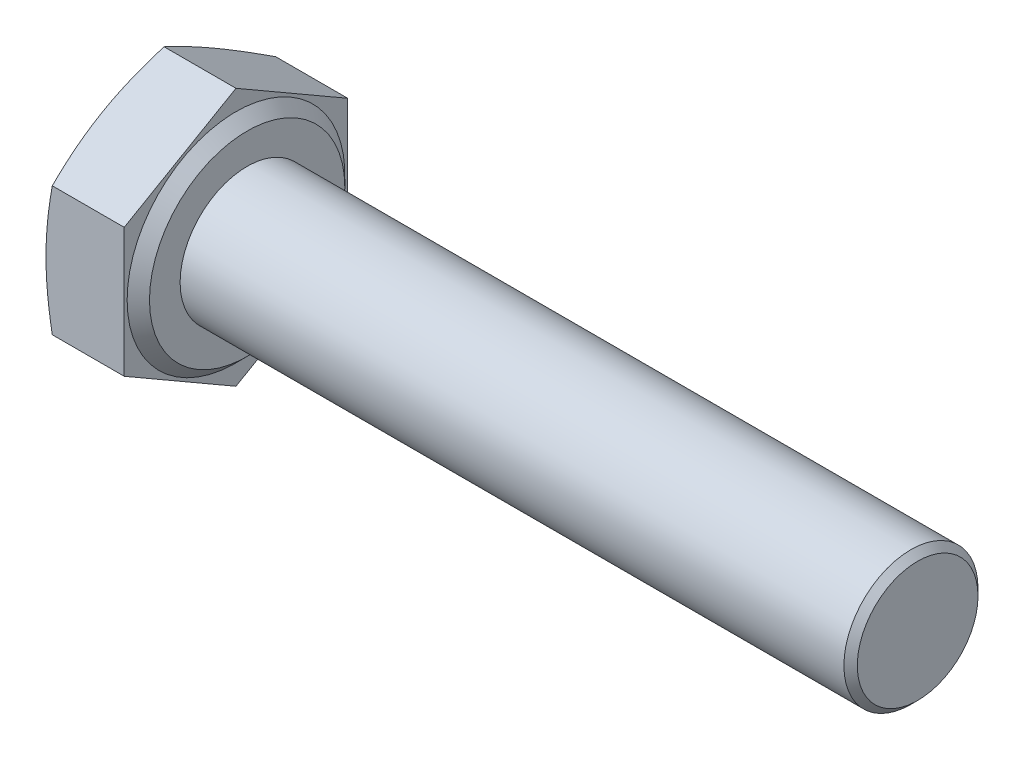
ISO-10303-21;
HEADER;
FILE_DESCRIPTION(('STEP AP214'),'2;1');
FILE_NAME('part.step','',(''),(''),'','','');
FILE_SCHEMA(('AUTOMOTIVE_DESIGN { 1 0 10303 214 1 1 1 1 }'));
ENDSEC;
DATA;
#1=APPLICATION_CONTEXT('core data for automotive mechanical design processes');
#2=APPLICATION_PROTOCOL_DEFINITION('international standard','automotive_design',2000,#1);
#3=PRODUCT_CONTEXT('',#1,'mechanical');
#4=PRODUCT('Part','Part','',(#3));
#5=PRODUCT_RELATED_PRODUCT_CATEGORY('part','',(#4));
#6=PRODUCT_DEFINITION_FORMATION('','',#4);
#7=PRODUCT_DEFINITION_CONTEXT('part definition',#1,'design');
#8=PRODUCT_DEFINITION('design','',#6,#7);
#9=PRODUCT_DEFINITION_SHAPE('','',#8);
#10=(LENGTH_UNIT() NAMED_UNIT(*) SI_UNIT(.MILLI.,.METRE.));
#11=(NAMED_UNIT(*) PLANE_ANGLE_UNIT() SI_UNIT($,.RADIAN.));
#12=(NAMED_UNIT(*) SI_UNIT($,.STERADIAN.) SOLID_ANGLE_UNIT());
#13=UNCERTAINTY_MEASURE_WITH_UNIT(LENGTH_MEASURE(1.E-05),#10,'distance_accuracy_value','');
#14=(GEOMETRIC_REPRESENTATION_CONTEXT(3) GLOBAL_UNCERTAINTY_ASSIGNED_CONTEXT((#13)) GLOBAL_UNIT_ASSIGNED_CONTEXT((#10,
#11,#12)) REPRESENTATION_CONTEXT('',''));
#15=CARTESIAN_POINT('',(0.,0.,0.));
#16=DIRECTION('',(0.,0.,1.));
#17=DIRECTION('',(1.,0.,0.));
#18=AXIS2_PLACEMENT_3D('',#15,#16,#17);
#19=CARTESIAN_POINT('',(1.,-0.721687836487032,1.25));
#20=DIRECTION('',(-1.,0.,0.));
#21=DIRECTION('',(0.,0.,1.));
#22=AXIS2_PLACEMENT_3D('',#19,#20,#21);
#23=PLANE('',#22);
#24=CARTESIAN_POINT('',(1.,0.,0.));
#25=DIRECTION('',(-1.,0.,0.));
#26=DIRECTION('',(0.,0.,1.));
#27=AXIS2_PLACEMENT_3D('',#24,#25,#26);
#28=CIRCLE('',#27,1.0925);
#29=CARTESIAN_POINT('',(1.,0.,1.0925));
#30=VERTEX_POINT('',#29);
#31=EDGE_CURVE('E268',#30,#30,#28,.T.);
#32=ORIENTED_EDGE('',*,*,#31,.F.);
#33=EDGE_LOOP('',(#32));
#34=FACE_BOUND('',#33,.T.);
#35=CARTESIAN_POINT('',(1.,0.,0.));
#36=DIRECTION('',(-1.,0.,0.));
#37=DIRECTION('',(0.,0.,1.));
#38=AXIS2_PLACEMENT_3D('',#35,#36,#37);
#39=CIRCLE('',#38,0.75);
#40=CARTESIAN_POINT('',(1.,0.,0.75));
#41=VERTEX_POINT('',#40);
#42=EDGE_CURVE('E157',#41,#41,#39,.F.);
#43=ORIENTED_EDGE('',*,*,#42,.F.);
#44=EDGE_LOOP('',(#43));
#45=FACE_BOUND('',#44,.T.);
#46=ADVANCED_FACE('F39',(#34,#45),#23,.F.);
#47=CARTESIAN_POINT('',(1.,-0.721687836487032,1.25));
#48=DIRECTION('',(0.,0.866025403784439,-0.5));
#49=DIRECTION('',(0.,0.5,0.866025403784439));
#50=AXIS2_PLACEMENT_3D('',#47,#48,#49);
#51=PLANE('',#50);
#52=CARTESIAN_POINT('',(0.0703934962245912,-1.44340454048752,-4.99999999998259E-05));
#53=CARTESIAN_POINT('',(0.0595105408724881,-1.41351548357099,0.05171936516975));
#54=CARTESIAN_POINT('',(0.0496105972959138,-1.38352786337432,0.10365944694846));
#55=CARTESIAN_POINT('',(0.0321931633280293,-1.32335763411529,0.207877341128181));
#56=CARTESIAN_POINT('',(0.0246775373589187,-1.29317489120078,0.260155385367894));
#57=CARTESIAN_POINT('',(0.0125212222860797,-1.23294938687038,0.364469018779612));
#58=CARTESIAN_POINT('',(0.00785401755391675,-1.20290800096114,0.41650222550419));
#59=CARTESIAN_POINT('',(0.00159398285412419,-1.14275497455162,0.520690323474514));
#60=CARTESIAN_POINT('',(0.,-1.11264336464108,0.572845161737257));
#61=CARTESIAN_POINT('',(0.,-1.05242014482001,0.677154838262743));
#62=CARTESIAN_POINT('',(0.00159398285412424,-1.02230853490948,0.729309676525486));
#63=CARTESIAN_POINT('',(0.00785401755391676,-0.962155508499954,0.833497774495811));
#64=CARTESIAN_POINT('',(0.0125212222860797,-0.93211412259072,0.885530981220388));
#65=CARTESIAN_POINT('',(0.0246775373589186,-0.871888618260317,0.989844614632106));
#66=CARTESIAN_POINT('',(0.0321931633280292,-0.841705875345811,1.04212265887182));
#67=CARTESIAN_POINT('',(0.0496105972959138,-0.781535646086773,1.14634055305154));
#68=CARTESIAN_POINT('',(0.0595105408724881,-0.751548025890104,1.19828063483025));
#69=CARTESIAN_POINT('',(0.0703934962245913,-0.721658968973573,1.25005));
#70=B_SPLINE_CURVE_WITH_KNOTS('',3,(#52,#53,#54,#55,#56,#57,#58,#59,#60,#61,#62,#63,#64,#65,#66,
#67,#68,#69),.UNSPECIFIED.,.F.,.F.,(4,2,2,2,2,2,2,2,4),(0.,0.182300878208644,0.364743957609247,
0.545461705562646,0.726111645974348,0.90676158638605,1.08747933433945,1.26992241374005,
1.4522232919487),.UNSPECIFIED.);
#71=CARTESIAN_POINT('',(0.0703829889937536,-1.44337567297406,0.));
#72=VERTEX_POINT('',#71);
#73=CARTESIAN_POINT('',(0.,-1.08253175473055,0.625));
#74=VERTEX_POINT('',#73);
#75=EDGE_CURVE('E288',#72,#74,#70,.T.);
#76=ORIENTED_EDGE('',*,*,#75,.F.);
#77=DIRECTION('',(-1.,0.,0.));
#78=VECTOR('',#77,1.);
#79=CARTESIAN_POINT('',(1.,-1.44337567297406,0.));
#80=LINE('',#79,#78);
#81=CARTESIAN_POINT('',(0.875,-1.44337567297406,0.));
#82=VERTEX_POINT('',#81);
#83=EDGE_CURVE('E150',#82,#72,#80,.T.);
#84=ORIENTED_EDGE('',*,*,#83,.F.);
#85=DIRECTION('',(0.,-0.5,-0.866025403784439));
#86=VECTOR('',#85,1.);
#87=CARTESIAN_POINT('',(0.875,-0.721687836487032,1.25));
#88=LINE('',#87,#86);
#89=CARTESIAN_POINT('',(0.875,-0.721687836487032,1.25));
#90=VERTEX_POINT('',#89);
#91=EDGE_CURVE('E141',#90,#82,#88,.T.);
#92=ORIENTED_EDGE('',*,*,#91,.F.);
#93=DIRECTION('',(-1.,0.,0.));
#94=VECTOR('',#93,1.);
#95=CARTESIAN_POINT('',(1.,-0.721687836487032,1.25));
#96=LINE('',#95,#94);
#97=CARTESIAN_POINT('',(0.0703829889937536,-0.721687836487032,1.25));
#98=VERTEX_POINT('',#97);
#99=EDGE_CURVE('E136',#90,#98,#96,.T.);
#100=ORIENTED_EDGE('',*,*,#99,.T.);
#101=EDGE_CURVE('E130',#74,#98,#70,.T.);
#102=ORIENTED_EDGE('',*,*,#101,.F.);
#103=EDGE_LOOP('',(#76,#84,#92,#100,#102));
#104=FACE_BOUND('',#103,.T.);
#105=ADVANCED_FACE('F173',(#104),#51,.F.);
#106=CARTESIAN_POINT('',(1.,-1.44337567297406,0.));
#107=DIRECTION('',(0.,0.866025403784439,0.5));
#108=DIRECTION('',(0.,-0.5,0.866025403784439));
#109=AXIS2_PLACEMENT_3D('',#106,#107,#108);
#110=PLANE('',#109);
#111=CARTESIAN_POINT('',(0.0703934962245913,-0.721658968973574,-1.25005));
#112=CARTESIAN_POINT('',(0.0595105408724882,-0.751548025890105,-1.19828063483025));
#113=CARTESIAN_POINT('',(0.0496105972959139,-0.781535646086774,-1.14634055305154));
#114=CARTESIAN_POINT('',(0.0321931633280294,-0.841705875345812,-1.04212265887182));
#115=CARTESIAN_POINT('',(0.0246775373589187,-0.871888618260317,-0.989844614632106));
#116=CARTESIAN_POINT('',(0.0125212222860798,-0.932114122590721,-0.885530981220388));
#117=CARTESIAN_POINT('',(0.00785401755391687,-0.962155508499955,-0.83349777449581));
#118=CARTESIAN_POINT('',(0.00159398285412432,-1.02230853490948,-0.729309676525486));
#119=CARTESIAN_POINT('',(0.,-1.05242014482001,-0.677154838262743));
#120=CARTESIAN_POINT('',(0.,-1.11264336464109,-0.572845161737257));
#121=CARTESIAN_POINT('',(0.00159398285412432,-1.14275497455162,-0.520690323474514));
#122=CARTESIAN_POINT('',(0.00785401755391688,-1.20290800096114,-0.416502225504189));
#123=CARTESIAN_POINT('',(0.0125212222860798,-1.23294938687038,-0.364469018779612));
#124=CARTESIAN_POINT('',(0.0246775373589187,-1.29317489120078,-0.260155385367894));
#125=CARTESIAN_POINT('',(0.0321931633280294,-1.32335763411529,-0.207877341128181));
#126=CARTESIAN_POINT('',(0.0496105972959138,-1.38352786337432,-0.10365944694846));
#127=CARTESIAN_POINT('',(0.0595105408724882,-1.41351548357099,-0.0517193651697496));
#128=CARTESIAN_POINT('',(0.0703934962245912,-1.44340454048752,5.00000000003068E-05));
#129=B_SPLINE_CURVE_WITH_KNOTS('',3,(#111,#112,#113,#114,#115,#116,#117,#118,#119,#120,#121,
#122,#123,#124,#125,#126,#127,#128),.UNSPECIFIED.,.F.,.F.,(4,2,2,2,2,2,2,2,4),(0.,
0.182300878208644,0.364743957609246,0.545461705562646,0.726111645974348,0.90676158638605,
1.08747933433945,1.26992241374005,1.4522232919487),.UNSPECIFIED.);
#130=CARTESIAN_POINT('',(0.0703829889937536,-0.721687836487033,-1.25));
#131=VERTEX_POINT('',#130);
#132=CARTESIAN_POINT('',(0.,-1.08253175473055,-0.625));
#133=VERTEX_POINT('',#132);
#134=EDGE_CURVE('E237',#131,#133,#129,.T.);
#135=ORIENTED_EDGE('',*,*,#134,.F.);
#136=DIRECTION('',(-1.,0.,0.));
#137=VECTOR('',#136,1.);
#138=CARTESIAN_POINT('',(1.,-0.721687836487033,-1.25));
#139=LINE('',#138,#137);
#140=CARTESIAN_POINT('',(0.875,-0.721687836487033,-1.25));
#141=VERTEX_POINT('',#140);
#142=EDGE_CURVE('E147',#141,#131,#139,.T.);
#143=ORIENTED_EDGE('',*,*,#142,.F.);
#144=DIRECTION('',(0.,0.5,-0.866025403784439));
#145=VECTOR('',#144,1.);
#146=CARTESIAN_POINT('',(0.875,-1.44337567297406,0.));
#147=LINE('',#146,#145);
#148=EDGE_CURVE('E278',#82,#141,#147,.T.);
#149=ORIENTED_EDGE('',*,*,#148,.F.);
#150=ORIENTED_EDGE('',*,*,#83,.T.);
#151=EDGE_CURVE('E231',#133,#72,#129,.T.);
#152=ORIENTED_EDGE('',*,*,#151,.F.);
#153=EDGE_LOOP('',(#135,#143,#149,#150,#152));
#154=FACE_BOUND('',#153,.T.);
#155=ADVANCED_FACE('F179',(#154),#110,.F.);
#156=CARTESIAN_POINT('',(1.,-0.721687836487033,-1.25));
#157=DIRECTION('',(0.,0.,1.));
#158=DIRECTION('',(0.,-1.,0.));
#159=AXIS2_PLACEMENT_3D('',#156,#157,#158);
#160=PLANE('',#159);
#161=CARTESIAN_POINT('',(0.376098848372429,-1.91077584996004,-1.25));
#162=CARTESIAN_POINT('',(0.358875967832388,-1.8542211665393,-1.25));
#163=CARTESIAN_POINT('',(0.341857102840544,-1.79760438955892,-1.25));
#164=CARTESIAN_POINT('',(0.308332424765673,-1.68421445520274,-1.25));
#165=CARTESIAN_POINT('',(0.291826652280679,-1.62744128583746,-1.25));
#166=CARTESIAN_POINT('',(0.243181204119384,-1.45664384946118,-1.25));
#167=CARTESIAN_POINT('',(0.211977321519544,-1.34234878100321,-1.25));
#168=CARTESIAN_POINT('',(0.153786296039663,-1.11417641963434,-1.25));
#169=CARTESIAN_POINT('',(0.126751796800107,-1.00031142694726,-1.25));
#170=CARTESIAN_POINT('',(0.0785676621877715,-0.771347013821274,-1.25));
#171=CARTESIAN_POINT('',(0.0574155455387038,-0.656248135196304,-1.25));
#172=CARTESIAN_POINT('',(0.0258715478466251,-0.43767913069722,-1.25));
#173=CARTESIAN_POINT('',(0.0145386424739606,-0.3343532354956,-1.25));
#174=CARTESIAN_POINT('',(0.00426199492431999,-0.178961143714622,-1.25));
#175=CARTESIAN_POINT('',(0.00195661593833473,-0.127110497608853,-1.25));
#176=CARTESIAN_POINT('',(-0.000310040400433931,-0.0233558161839074,-1.25));
#177=CARTESIAN_POINT('',(-0.00027133430694277,0.028548218755653,-1.25));
#178=CARTESIAN_POINT('',(0.00215882800836514,0.132561095753679,-1.25));
#179=CARTESIAN_POINT('',(0.00456210554012848,0.184669656396588,-1.25));
#180=CARTESIAN_POINT('',(0.0116084071377238,0.288737621513527,-1.25));
#181=CARTESIAN_POINT('',(0.0162516928049605,0.340697007852949,-1.25));
#182=CARTESIAN_POINT('',(0.0332242668009618,0.496315769593781,-1.25));
#183=CARTESIAN_POINT('',(0.0485941097570047,0.599645380431458,-1.25));
#184=CARTESIAN_POINT('',(0.0862011867972934,0.810645681596743,-1.25));
#185=CARTESIAN_POINT('',(0.108759257382448,0.91825614745555,-1.25));
#186=CARTESIAN_POINT('',(0.158215811231366,1.13249342308789,-1.25));
#187=CARTESIAN_POINT('',(0.185115857812395,1.23911986389278,-1.25));
#188=CARTESIAN_POINT('',(0.241810302305072,1.45173659694754,-1.25));
#189=CARTESIAN_POINT('',(0.271608400119218,1.55772588759366,-1.25));
#190=CARTESIAN_POINT('',(0.333121487900566,1.76912398050936,-1.25));
#191=CARTESIAN_POINT('',(0.364836173718185,1.87453287200259,-1.25));
#192=CARTESIAN_POINT('',(0.42923449470962,2.0837790569124,-1.25));
#193=CARTESIAN_POINT('',(0.461903570847791,2.18762085499794,-1.25));
#194=CARTESIAN_POINT('',(0.528169678193103,2.39501252641495,-1.25));
#195=CARTESIAN_POINT('',(0.561766753922373,2.49856238547665,-1.25));
#196=CARTESIAN_POINT('',(0.629508548662558,2.70504713051974,-1.25));
#197=CARTESIAN_POINT('',(0.663650706030229,2.80798285910894,-1.25));
#198=CARTESIAN_POINT('',(0.732446928036465,3.01367382703376,-1.25));
#199=CARTESIAN_POINT('',(0.767100950280298,3.11642908053702,-1.25));
#200=CARTESIAN_POINT('',(0.801934049040919,3.21912272736574,-1.25));
#201=B_SPLINE_CURVE_WITH_KNOTS('',3,(#161,#162,#163,#164,#165,#166,#167,#168,#169,#170,#171,
#172,#173,#174,#175,#176,#177,#178,#179,#180,#181,#182,#183,#184,#185,#186,#187,#188,#189,#190,
#191,#192,#193,#194,#195,#196,#197,#198,#199,#200),.UNSPECIFIED.,.F.,.F.,(4,2,2,2,2,2,2,2,2,2,2,
2,2,2,2,2,2,2,2,4),(0.,0.177356117295142,0.354726232214786,0.710116655462465,1.06111399289692,
1.41196304909719,1.72344646157246,1.87910490048074,2.03476224014275,2.19120173927014,
2.3476595127524,2.66078561204115,2.99050970564148,3.32035278145431,3.65062263383817,
3.98084021156012,4.30741289981244,4.63400128317184,4.95935047884045,5.28467287720402),.UNSPECIFIED.);
#202=CARTESIAN_POINT('',(0.0703829889937536,0.721687836487032,-1.25));
#203=VERTEX_POINT('',#202);
#204=CARTESIAN_POINT('',(0.,0.,-1.25));
#205=VERTEX_POINT('',#204);
#206=EDGE_CURVE('E313',#203,#205,#201,.F.);
#207=ORIENTED_EDGE('',*,*,#206,.F.);
#208=DIRECTION('',(-1.,0.,0.));
#209=VECTOR('',#208,1.);
#210=CARTESIAN_POINT('',(1.,0.721687836487033,-1.25));
#211=LINE('',#210,#209);
#212=CARTESIAN_POINT('',(0.875,0.721687836487032,-1.25));
#213=VERTEX_POINT('',#212);
#214=EDGE_CURVE('E138',#213,#203,#211,.T.);
#215=ORIENTED_EDGE('',*,*,#214,.F.);
#216=DIRECTION('',(0.,1.,0.));
#217=VECTOR('',#216,1.);
#218=CARTESIAN_POINT('',(0.875,-0.721687836487033,-1.25));
#219=LINE('',#218,#217);
#220=EDGE_CURVE('E270',#141,#213,#219,.T.);
#221=ORIENTED_EDGE('',*,*,#220,.F.);
#222=ORIENTED_EDGE('',*,*,#142,.T.);
#223=EDGE_CURVE('E238',#205,#131,#201,.F.);
#224=ORIENTED_EDGE('',*,*,#223,.F.);
#225=EDGE_LOOP('',(#207,#215,#221,#222,#224));
#226=FACE_BOUND('',#225,.T.);
#227=ADVANCED_FACE('F247',(#226),#160,.F.);
#228=CARTESIAN_POINT('',(1.,0.721687836487033,-1.25));
#229=DIRECTION('',(0.,-0.866025403784439,0.5));
#230=DIRECTION('',(0.,-0.5,-0.866025403784439));
#231=AXIS2_PLACEMENT_3D('',#228,#229,#230);
#232=PLANE('',#231);
#233=CARTESIAN_POINT('',(0.0703934962245912,1.44340454048752,4.99999999997083E-05));
#234=CARTESIAN_POINT('',(0.0595105408724881,1.41351548357099,-0.05171936516975));
#235=CARTESIAN_POINT('',(0.0496105972959138,1.38352786337432,-0.10365944694846));
#236=CARTESIAN_POINT('',(0.0321931633280293,1.32335763411529,-0.207877341128181));
#237=CARTESIAN_POINT('',(0.0246775373589187,1.29317489120078,-0.260155385367894));
#238=CARTESIAN_POINT('',(0.0125212222860797,1.23294938687038,-0.364469018779612));
#239=CARTESIAN_POINT('',(0.0078540175539168,1.20290800096114,-0.41650222550419));
#240=CARTESIAN_POINT('',(0.00159398285412422,1.14275497455162,-0.520690323474514));
#241=CARTESIAN_POINT('',(0.,1.11264336464108,-0.572845161737257));
#242=CARTESIAN_POINT('',(0.,1.05242014482001,-0.677154838262743));
#243=CARTESIAN_POINT('',(0.00159398285412418,1.02230853490948,-0.729309676525486));
#244=CARTESIAN_POINT('',(0.00785401755391672,0.962155508499955,-0.83349777449581));
#245=CARTESIAN_POINT('',(0.0125212222860797,0.93211412259072,-0.885530981220388));
#246=CARTESIAN_POINT('',(0.0246775373589186,0.871888618260317,-0.989844614632106));
#247=CARTESIAN_POINT('',(0.0321931633280292,0.841705875345812,-1.04212265887182));
#248=CARTESIAN_POINT('',(0.0496105972959137,0.781535646086774,-1.14634055305154));
#249=CARTESIAN_POINT('',(0.059510540872488,0.751548025890104,-1.19828063483025));
#250=CARTESIAN_POINT('',(0.0703934962245911,0.721658968973573,-1.25005));
#251=B_SPLINE_CURVE_WITH_KNOTS('',3,(#233,#234,#235,#236,#237,#238,#239,#240,#241,#242,#243,
#244,#245,#246,#247,#248,#249,#250),.UNSPECIFIED.,.F.,.F.,(4,2,2,2,2,2,2,2,4),(0.,
0.182300878208644,0.364743957609246,0.545461705562645,0.726111645974347,0.906761586386049,
1.08747933433945,1.26992241374005,1.45222329194869),.UNSPECIFIED.);
#252=CARTESIAN_POINT('',(0.0703829889937536,1.44337567297406,0.));
#253=VERTEX_POINT('',#252);
#254=CARTESIAN_POINT('',(0.,1.08253175473055,-0.625));
#255=VERTEX_POINT('',#254);
#256=EDGE_CURVE('E225',#253,#255,#251,.T.);
#257=ORIENTED_EDGE('',*,*,#256,.F.);
#258=DIRECTION('',(-1.,0.,0.));
#259=VECTOR('',#258,1.);
#260=CARTESIAN_POINT('',(1.,1.44337567297406,0.));
#261=LINE('',#260,#259);
#262=CARTESIAN_POINT('',(0.875,1.44337567297406,0.));
#263=VERTEX_POINT('',#262);
#264=EDGE_CURVE('E135',#263,#253,#261,.T.);
#265=ORIENTED_EDGE('',*,*,#264,.F.);
#266=DIRECTION('',(0.,0.5,0.866025403784439));
#267=VECTOR('',#266,1.);
#268=CARTESIAN_POINT('',(0.875,0.721687836487033,-1.25));
#269=LINE('',#268,#267);
#270=EDGE_CURVE('E267',#213,#263,#269,.T.);
#271=ORIENTED_EDGE('',*,*,#270,.F.);
#272=ORIENTED_EDGE('',*,*,#214,.T.);
#273=EDGE_CURVE('E264',#255,#203,#251,.T.);
#274=ORIENTED_EDGE('',*,*,#273,.F.);
#275=EDGE_LOOP('',(#257,#265,#271,#272,#274));
#276=FACE_BOUND('',#275,.T.);
#277=ADVANCED_FACE('F252',(#276),#232,.F.);
#278=CARTESIAN_POINT('',(1.,1.44337567297406,0.));
#279=DIRECTION('',(0.,-0.866025403784439,-0.5));
#280=DIRECTION('',(0.,0.5,-0.866025403784439));
#281=AXIS2_PLACEMENT_3D('',#278,#279,#280);
#282=PLANE('',#281);
#283=CARTESIAN_POINT('',(0.0703934962245912,0.721658968973573,1.25005));
#284=CARTESIAN_POINT('',(0.0595105408724881,0.751548025890104,1.19828063483025));
#285=CARTESIAN_POINT('',(0.0496105972959138,0.781535646086774,1.14634055305154));
#286=CARTESIAN_POINT('',(0.0321931633280293,0.841705875345812,1.04212265887182));
#287=CARTESIAN_POINT('',(0.0246775373589187,0.871888618260317,0.989844614632106));
#288=CARTESIAN_POINT('',(0.0125212222860797,0.93211412259072,0.885530981220388));
#289=CARTESIAN_POINT('',(0.00785401755391674,0.962155508499955,0.83349777449581));
#290=CARTESIAN_POINT('',(0.00159398285412416,1.02230853490948,0.729309676525486));
#291=CARTESIAN_POINT('',(0.,1.05242014482001,0.677154838262743));
#292=CARTESIAN_POINT('',(0.,1.11264336464108,0.572845161737257));
#293=CARTESIAN_POINT('',(0.00159398285412424,1.14275497455162,0.520690323474514));
#294=CARTESIAN_POINT('',(0.00785401755391682,1.20290800096114,0.416502225504189));
#295=CARTESIAN_POINT('',(0.0125212222860797,1.23294938687038,0.364469018779612));
#296=CARTESIAN_POINT('',(0.0246775373589187,1.29317489120078,0.260155385367894));
#297=CARTESIAN_POINT('',(0.0321931633280293,1.32335763411529,0.207877341128181));
#298=CARTESIAN_POINT('',(0.0496105972959138,1.38352786337432,0.10365944694846));
#299=CARTESIAN_POINT('',(0.0595105408724881,1.41351548357099,0.0517193651697497));
#300=CARTESIAN_POINT('',(0.0703934962245912,1.44340454048752,-5.00000000000627E-05));
#301=B_SPLINE_CURVE_WITH_KNOTS('',3,(#283,#284,#285,#286,#287,#288,#289,#290,#291,#292,#293,
#294,#295,#296,#297,#298,#299,#300),.UNSPECIFIED.,.F.,.F.,(4,2,2,2,2,2,2,2,4),(0.,
0.182300878208644,0.364743957609246,0.545461705562645,0.726111645974348,0.90676158638605,
1.08747933433945,1.26992241374005,1.4522232919487),.UNSPECIFIED.);
#302=CARTESIAN_POINT('',(0.0703829889937536,0.721687836487033,1.25));
#303=VERTEX_POINT('',#302);
#304=CARTESIAN_POINT('',(0.,1.08253175473055,0.625));
#305=VERTEX_POINT('',#304);
#306=EDGE_CURVE('E115',#303,#305,#301,.T.);
#307=ORIENTED_EDGE('',*,*,#306,.F.);
#308=DIRECTION('',(-1.,0.,0.));
#309=VECTOR('',#308,1.);
#310=CARTESIAN_POINT('',(1.,0.721687836487033,1.25));
#311=LINE('',#310,#309);
#312=CARTESIAN_POINT('',(0.875,0.721687836487033,1.25));
#313=VERTEX_POINT('',#312);
#314=EDGE_CURVE('E127',#313,#303,#311,.T.);
#315=ORIENTED_EDGE('',*,*,#314,.F.);
#316=DIRECTION('',(0.,-0.5,0.866025403784439));
#317=VECTOR('',#316,1.);
#318=CARTESIAN_POINT('',(0.875,1.44337567297406,0.));
#319=LINE('',#318,#317);
#320=EDGE_CURVE('E62',#263,#313,#319,.T.);
#321=ORIENTED_EDGE('',*,*,#320,.F.);
#322=ORIENTED_EDGE('',*,*,#264,.T.);
#323=EDGE_CURVE('E129',#305,#253,#301,.T.);
#324=ORIENTED_EDGE('',*,*,#323,.F.);
#325=EDGE_LOOP('',(#307,#315,#321,#322,#324));
#326=FACE_BOUND('',#325,.T.);
#327=ADVANCED_FACE('F126',(#326),#282,.F.);
#328=CARTESIAN_POINT('',(1.,0.721687836487033,1.25));
#329=DIRECTION('',(0.,0.,-1.));
#330=DIRECTION('',(0.,1.,0.));
#331=AXIS2_PLACEMENT_3D('',#328,#329,#330);
#332=PLANE('',#331);
#333=CARTESIAN_POINT('',(0.376098848372429,-1.91077584996004,1.25));
#334=CARTESIAN_POINT('',(0.358875967832388,-1.8542211665393,1.25));
#335=CARTESIAN_POINT('',(0.341857102840543,-1.79760438955892,1.25));
#336=CARTESIAN_POINT('',(0.308332424765672,-1.68421445520274,1.25));
#337=CARTESIAN_POINT('',(0.291826652280679,-1.62744128583746,1.25));
#338=CARTESIAN_POINT('',(0.243181204119384,-1.45664384946118,1.25));
#339=CARTESIAN_POINT('',(0.211977321519544,-1.34234878100321,1.25));
#340=CARTESIAN_POINT('',(0.153786296039664,-1.11417641963434,1.25));
#341=CARTESIAN_POINT('',(0.126751796800107,-1.00031142694726,1.25));
#342=CARTESIAN_POINT('',(0.0785676621877715,-0.771347013821273,1.25));
#343=CARTESIAN_POINT('',(0.0574155455387038,-0.656248135196303,1.25));
#344=CARTESIAN_POINT('',(0.0258715478466251,-0.437679130697219,1.25));
#345=CARTESIAN_POINT('',(0.0145386424739605,-0.334353235495599,1.25));
#346=CARTESIAN_POINT('',(0.00426199492431998,-0.178961143714621,1.25));
#347=CARTESIAN_POINT('',(0.00195661593833475,-0.127110497608852,1.25));
#348=CARTESIAN_POINT('',(-0.000310040400433858,-0.0233558161839067,1.25));
#349=CARTESIAN_POINT('',(-0.000271334306942666,0.0285482187556537,1.25));
#350=CARTESIAN_POINT('',(0.00215882800836526,0.132561095753679,1.25));
#351=CARTESIAN_POINT('',(0.00456210554012859,0.184669656396588,1.25));
#352=CARTESIAN_POINT('',(0.0116084071377239,0.288737621513528,1.25));
#353=CARTESIAN_POINT('',(0.0162516928049606,0.340697007852949,1.25));
#354=CARTESIAN_POINT('',(0.0332242668009619,0.496315769593781,1.25));
#355=CARTESIAN_POINT('',(0.0485941097570048,0.599645380431459,1.25));
#356=CARTESIAN_POINT('',(0.0862011867972934,0.810645681596743,1.25));
#357=CARTESIAN_POINT('',(0.108759257382448,0.91825614745555,1.25));
#358=CARTESIAN_POINT('',(0.158215811231366,1.13249342308789,1.25));
#359=CARTESIAN_POINT('',(0.185115857812395,1.23911986389278,1.25));
#360=CARTESIAN_POINT('',(0.241810302305071,1.45173659694754,1.25));
#361=CARTESIAN_POINT('',(0.271608400119218,1.55772588759366,1.25));
#362=CARTESIAN_POINT('',(0.333121487900565,1.76912398050936,1.25));
#363=CARTESIAN_POINT('',(0.364836173718184,1.87453287200259,1.25));
#364=CARTESIAN_POINT('',(0.429234494709619,2.0837790569124,1.25));
#365=CARTESIAN_POINT('',(0.461903570847791,2.18762085499794,1.25));
#366=CARTESIAN_POINT('',(0.528169678193102,2.39501252641495,1.25));
#367=CARTESIAN_POINT('',(0.561766753922372,2.49856238547665,1.25));
#368=CARTESIAN_POINT('',(0.629508548662557,2.70504713051974,1.25));
#369=CARTESIAN_POINT('',(0.663650706030228,2.80798285910894,1.25));
#370=CARTESIAN_POINT('',(0.732446928036465,3.01367382703376,1.25));
#371=CARTESIAN_POINT('',(0.767100950280298,3.11642908053702,1.25));
#372=CARTESIAN_POINT('',(0.801934049040919,3.21912272736574,1.25));
#373=B_SPLINE_CURVE_WITH_KNOTS('',3,(#333,#334,#335,#336,#337,#338,#339,#340,#341,#342,#343,
#344,#345,#346,#347,#348,#349,#350,#351,#352,#353,#354,#355,#356,#357,#358,#359,#360,#361,#362,
#363,#364,#365,#366,#367,#368,#369,#370,#371,#372),.UNSPECIFIED.,.F.,.F.,(4,2,2,2,2,2,2,2,2,2,2,
2,2,2,2,2,2,2,2,4),(0.,0.177356117295143,0.354726232214785,0.710116655462464,1.06111399289692,
1.41196304909719,1.72344646157246,1.87910490048074,2.03476224014275,2.19120173927014,
2.34765951275241,2.66078561204115,2.99050970564148,3.32035278145431,3.65062263383816,
3.98084021156011,4.30741289981244,4.63400128317184,4.95935047884045,5.28467287720402),.UNSPECIFIED.);
#374=CARTESIAN_POINT('',(0.,0.,1.25));
#375=VERTEX_POINT('',#374);
#376=EDGE_CURVE('E121',#98,#375,#373,.T.);
#377=ORIENTED_EDGE('',*,*,#376,.F.);
#378=ORIENTED_EDGE('',*,*,#99,.F.);
#379=DIRECTION('',(0.,-1.,0.));
#380=VECTOR('',#379,1.);
#381=CARTESIAN_POINT('',(0.875,0.721687836487033,1.25));
#382=LINE('',#381,#380);
#383=EDGE_CURVE('E134',#313,#90,#382,.T.);
#384=ORIENTED_EDGE('',*,*,#383,.F.);
#385=ORIENTED_EDGE('',*,*,#314,.T.);
#386=EDGE_CURVE('E112',#375,#303,#373,.T.);
#387=ORIENTED_EDGE('',*,*,#386,.F.);
#388=EDGE_LOOP('',(#377,#378,#384,#385,#387));
#389=FACE_BOUND('',#388,.T.);
#390=ADVANCED_FACE('F132',(#389),#332,.F.);
#391=CARTESIAN_POINT('',(0.875,1.2175,0.));
#392=DIRECTION('',(1.,0.,0.));
#393=DIRECTION('',(0.,0.,-1.));
#394=AXIS2_PLACEMENT_3D('',#391,#392,#393);
#395=PLANE('',#394);
#396=CARTESIAN_POINT('',(0.875,0.,0.));
#397=DIRECTION('',(-1.,0.,0.));
#398=DIRECTION('',(0.,0.,1.));
#399=AXIS2_PLACEMENT_3D('',#396,#397,#398);
#400=CIRCLE('',#399,1.2175);
#401=CARTESIAN_POINT('',(0.875,0.,1.2175));
#402=VERTEX_POINT('',#401);
#403=EDGE_CURVE('E274',#402,#402,#400,.T.);
#404=ORIENTED_EDGE('',*,*,#403,.T.);
#405=EDGE_LOOP('',(#404));
#406=FACE_BOUND('',#405,.T.);
#407=ORIENTED_EDGE('',*,*,#91,.T.);
#408=ORIENTED_EDGE('',*,*,#148,.T.);
#409=ORIENTED_EDGE('',*,*,#220,.T.);
#410=ORIENTED_EDGE('',*,*,#270,.T.);
#411=ORIENTED_EDGE('',*,*,#320,.T.);
#412=ORIENTED_EDGE('',*,*,#383,.T.);
#413=EDGE_LOOP('',(#407,#408,#409,#410,#411,#412));
#414=FACE_BOUND('',#413,.T.);
#415=ADVANCED_FACE('F193',(#406,#414),#395,.T.);
#416=CARTESIAN_POINT('',(0.875,0.,0.));
#417=DIRECTION('',(-1.,0.,0.));
#418=DIRECTION('',(0.,0.,1.));
#419=AXIS2_PLACEMENT_3D('',#416,#417,#418);
#420=CONICAL_SURFACE('',#419,1.2175,0.785398163397453);
#421=ORIENTED_EDGE('',*,*,#31,.T.);
#422=EDGE_LOOP('',(#421));
#423=FACE_BOUND('',#422,.T.);
#424=ORIENTED_EDGE('',*,*,#403,.F.);
#425=EDGE_LOOP('',(#424));
#426=FACE_BOUND('',#425,.T.);
#427=ADVANCED_FACE('F185',(#423,#426),#420,.T.);
#428=CARTESIAN_POINT('',(0.,0.,0.));
#429=DIRECTION('',(1.,0.,0.));
#430=DIRECTION('',(0.,0.,-1.));
#431=AXIS2_PLACEMENT_3D('',#428,#429,#430);
#432=CONICAL_SURFACE('',#431,1.25,1.22173047639604);
#433=ORIENTED_EDGE('',*,*,#101,.T.);
#434=ORIENTED_EDGE('',*,*,#376,.T.);
#435=CARTESIAN_POINT('',(0.,0.,0.));
#436=DIRECTION('',(-1.,0.,0.));
#437=DIRECTION('',(0.,0.,1.));
#438=AXIS2_PLACEMENT_3D('',#435,#436,#437);
#439=CIRCLE('',#438,1.25);
#440=EDGE_CURVE('E54',#74,#375,#439,.T.);
#441=ORIENTED_EDGE('',*,*,#440,.F.);
#442=EDGE_LOOP('',(#433,#434,#441));
#443=FACE_BOUND('',#442,.T.);
#444=ADVANCED_FACE('F292',(#443),#432,.T.);
#445=ORIENTED_EDGE('',*,*,#151,.T.);
#446=ORIENTED_EDGE('',*,*,#75,.T.);
#447=EDGE_CURVE('E155',#133,#74,#439,.T.);
#448=ORIENTED_EDGE('',*,*,#447,.F.);
#449=EDGE_LOOP('',(#445,#446,#448));
#450=FACE_BOUND('',#449,.T.);
#451=ADVANCED_FACE('F301',(#450),#432,.T.);
#452=ORIENTED_EDGE('',*,*,#223,.T.);
#453=ORIENTED_EDGE('',*,*,#134,.T.);
#454=EDGE_CURVE('E296',#205,#133,#439,.T.);
#455=ORIENTED_EDGE('',*,*,#454,.F.);
#456=EDGE_LOOP('',(#452,#453,#455));
#457=FACE_BOUND('',#456,.T.);
#458=ADVANCED_FACE('F212',(#457),#432,.T.);
#459=ORIENTED_EDGE('',*,*,#206,.T.);
#460=EDGE_CURVE('E297',#255,#205,#439,.T.);
#461=ORIENTED_EDGE('',*,*,#460,.F.);
#462=ORIENTED_EDGE('',*,*,#273,.T.);
#463=EDGE_LOOP('',(#459,#461,#462));
#464=FACE_BOUND('',#463,.T.);
#465=ADVANCED_FACE('F207',(#464),#432,.T.);
#466=ORIENTED_EDGE('',*,*,#256,.T.);
#467=EDGE_CURVE('E156',#305,#255,#439,.T.);
#468=ORIENTED_EDGE('',*,*,#467,.F.);
#469=ORIENTED_EDGE('',*,*,#323,.T.);
#470=EDGE_LOOP('',(#466,#468,#469));
#471=FACE_BOUND('',#470,.T.);
#472=ADVANCED_FACE('F211',(#471),#432,.T.);
#473=ORIENTED_EDGE('',*,*,#306,.T.);
#474=CARTESIAN_POINT('',(0.,0.,0.));
#475=DIRECTION('',(-1.,0.,0.));
#476=DIRECTION('',(0.,0.,1.));
#477=AXIS2_PLACEMENT_3D('',#474,#475,#476);
#478=CIRCLE('',#477,1.25);
#479=EDGE_CURVE('E117',#375,#305,#478,.T.);
#480=ORIENTED_EDGE('',*,*,#479,.F.);
#481=ORIENTED_EDGE('',*,*,#386,.T.);
#482=EDGE_LOOP('',(#473,#480,#481));
#483=FACE_BOUND('',#482,.T.);
#484=ADVANCED_FACE('F114',(#483),#432,.T.);
#485=CARTESIAN_POINT('',(0.,-0.721687836487032,1.25));
#486=DIRECTION('',(-1.,0.,0.));
#487=DIRECTION('',(0.,0.,1.));
#488=AXIS2_PLACEMENT_3D('',#485,#486,#487);
#489=PLANE('',#488);
#490=ORIENTED_EDGE('',*,*,#440,.T.);
#491=ORIENTED_EDGE('',*,*,#479,.T.);
#492=ORIENTED_EDGE('',*,*,#467,.T.);
#493=ORIENTED_EDGE('',*,*,#460,.T.);
#494=ORIENTED_EDGE('',*,*,#454,.T.);
#495=ORIENTED_EDGE('',*,*,#447,.T.);
#496=EDGE_LOOP('',(#490,#491,#492,#493,#494,#495));
#497=FACE_BOUND('',#496,.T.);
#498=ADVANCED_FACE('F187',(#497),#489,.T.);
#499=CARTESIAN_POINT('',(8.5,0.,0.));
#500=DIRECTION('',(-1.,0.,0.));
#501=DIRECTION('',(0.,0.,1.));
#502=AXIS2_PLACEMENT_3D('',#499,#500,#501);
#503=CYLINDRICAL_SURFACE('',#502,0.75);
#504=CARTESIAN_POINT('',(8.425,0.,0.));
#505=DIRECTION('',(1.,0.,0.));
#506=DIRECTION('',(0.,0.,-1.));
#507=AXIS2_PLACEMENT_3D('',#504,#505,#506);
#508=CIRCLE('',#507,0.75);
#509=CARTESIAN_POINT('',(8.425,0.,-0.75));
#510=VERTEX_POINT('',#509);
#511=EDGE_CURVE('E11',#510,#510,#508,.F.);
#512=ORIENTED_EDGE('',*,*,#511,.T.);
#513=EDGE_LOOP('',(#512));
#514=FACE_BOUND('',#513,.T.);
#515=ORIENTED_EDGE('',*,*,#42,.T.);
#516=EDGE_LOOP('',(#515));
#517=FACE_BOUND('',#516,.T.);
#518=ADVANCED_FACE('F169',(#514,#517),#503,.T.);
#519=CARTESIAN_POINT('',(8.5,0.,0.));
#520=DIRECTION('',(1.,0.,0.));
#521=DIRECTION('',(0.,0.,-1.));
#522=AXIS2_PLACEMENT_3D('',#519,#520,#521);
#523=PLANE('',#522);
#524=CARTESIAN_POINT('',(8.5,0.,0.));
#525=DIRECTION('',(1.,0.,0.));
#526=DIRECTION('',(0.,0.,-1.));
#527=AXIS2_PLACEMENT_3D('',#524,#525,#526);
#528=CIRCLE('',#527,0.675000000000001);
#529=CARTESIAN_POINT('',(8.5,0.,-0.675000000000001));
#530=VERTEX_POINT('',#529);
#531=EDGE_CURVE('E47',#530,#530,#528,.T.);
#532=ORIENTED_EDGE('',*,*,#531,.T.);
#533=EDGE_LOOP('',(#532));
#534=FACE_BOUND('',#533,.T.);
#535=ADVANCED_FACE('F162',(#534),#523,.T.);
#536=CARTESIAN_POINT('',(8.5,0.,0.));
#537=DIRECTION('',(-1.,0.,0.));
#538=DIRECTION('',(0.,0.,1.));
#539=AXIS2_PLACEMENT_3D('',#536,#537,#538);
#540=CONICAL_SURFACE('',#539,0.675000000000001,0.785398163397439);
#541=ORIENTED_EDGE('',*,*,#511,.F.);
#542=EDGE_LOOP('',(#541));
#543=FACE_BOUND('',#542,.T.);
#544=ORIENTED_EDGE('',*,*,#531,.F.);
#545=EDGE_LOOP('',(#544));
#546=FACE_BOUND('',#545,.T.);
#547=ADVANCED_FACE('F41',(#543,#546),#540,.T.);
#548=CLOSED_SHELL('',(#46,#105,#155,#227,#277,#327,#390,#415,#427,#444,#451,#458,#465,#472,#484,
#498,#518,#535,#547));
#549=MANIFOLD_SOLID_BREP('B2',#548);
#550=ADVANCED_BREP_SHAPE_REPRESENTATION('',(#18,#549),#14);
#551=SHAPE_DEFINITION_REPRESENTATION(#9,#550);
ENDSEC;
END-ISO-10303-21;
